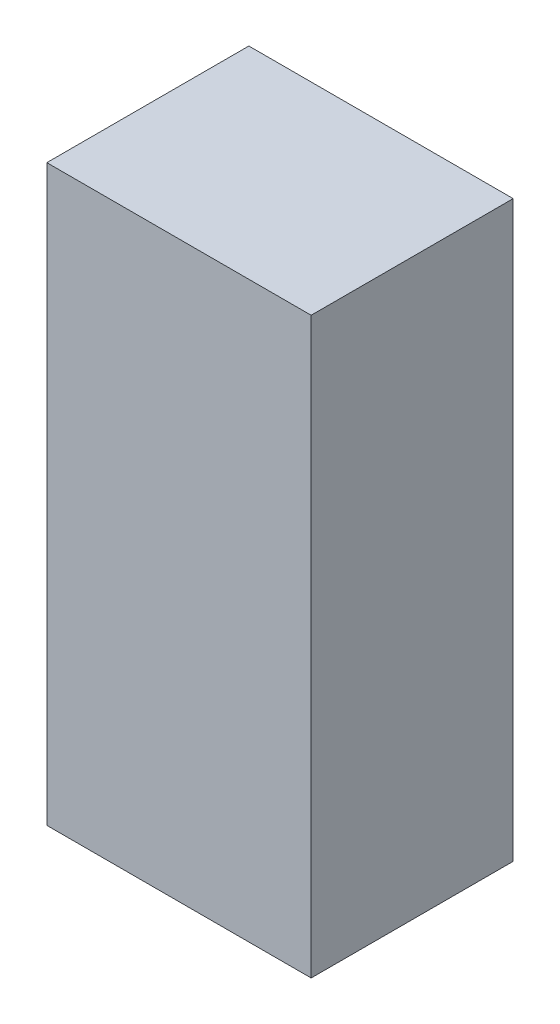
ISO-10303-21;
HEADER;
FILE_DESCRIPTION(('STEP AP214'),'2;1');
FILE_NAME('part.step','',(''),(''),'','','');
FILE_SCHEMA(('AUTOMOTIVE_DESIGN { 1 0 10303 214 1 1 1 1 }'));
ENDSEC;
DATA;
#1=APPLICATION_CONTEXT('core data for automotive mechanical design processes');
#2=APPLICATION_PROTOCOL_DEFINITION('international standard','automotive_design',2000,#1);
#3=PRODUCT_CONTEXT('',#1,'mechanical');
#4=PRODUCT('Part','Part','',(#3));
#5=PRODUCT_RELATED_PRODUCT_CATEGORY('part','',(#4));
#6=PRODUCT_DEFINITION_FORMATION('','',#4);
#7=PRODUCT_DEFINITION_CONTEXT('part definition',#1,'design');
#8=PRODUCT_DEFINITION('design','',#6,#7);
#9=PRODUCT_DEFINITION_SHAPE('','',#8);
#10=(LENGTH_UNIT() NAMED_UNIT(*) SI_UNIT(.MILLI.,.METRE.));
#11=(NAMED_UNIT(*) PLANE_ANGLE_UNIT() SI_UNIT($,.RADIAN.));
#12=(NAMED_UNIT(*) SI_UNIT($,.STERADIAN.) SOLID_ANGLE_UNIT());
#13=UNCERTAINTY_MEASURE_WITH_UNIT(LENGTH_MEASURE(1.E-05),#10,'distance_accuracy_value','');
#14=(GEOMETRIC_REPRESENTATION_CONTEXT(3) GLOBAL_UNCERTAINTY_ASSIGNED_CONTEXT((#13)) GLOBAL_UNIT_ASSIGNED_CONTEXT((#10,
#11,#12)) REPRESENTATION_CONTEXT('',''));
#15=CARTESIAN_POINT('',(0.,0.,0.));
#16=DIRECTION('',(0.,0.,1.));
#17=DIRECTION('',(1.,0.,0.));
#18=AXIS2_PLACEMENT_3D('',#15,#16,#17);
#19=CARTESIAN_POINT('',(0.70000114,-1.5199995,1.0700004));
#20=DIRECTION('',(0.,0.,-1.));
#21=DIRECTION('',(-1.,0.,0.));
#22=AXIS2_PLACEMENT_3D('',#19,#20,#21);
#23=PLANE('',#22);
#24=DIRECTION('',(1.,0.,0.));
#25=VECTOR('',#24,1.);
#26=CARTESIAN_POINT('',(0.70000114,1.5199995,1.0700004));
#27=LINE('',#26,#25);
#28=CARTESIAN_POINT('',(0.70000114,1.5199995,1.0700004));
#29=VERTEX_POINT('',#28);
#30=CARTESIAN_POINT('',(-0.6999986,1.5199995,1.0700004));
#31=VERTEX_POINT('',#30);
#32=EDGE_CURVE('E55',#29,#31,#27,.F.);
#33=ORIENTED_EDGE('',*,*,#32,.T.);
#34=DIRECTION('',(0.,1.,0.));
#35=VECTOR('',#34,1.);
#36=CARTESIAN_POINT('',(-0.6999986,1.5199995,1.0700004));
#37=LINE('',#36,#35);
#38=CARTESIAN_POINT('',(-0.6999986,-1.5199995,1.0700004));
#39=VERTEX_POINT('',#38);
#40=EDGE_CURVE('E57',#31,#39,#37,.F.);
#41=ORIENTED_EDGE('',*,*,#40,.T.);
#42=DIRECTION('',(1.,0.,0.));
#43=VECTOR('',#42,1.);
#44=CARTESIAN_POINT('',(-0.6999986,-1.5199995,1.0700004));
#45=LINE('',#44,#43);
#46=CARTESIAN_POINT('',(0.70000114,-1.5199995,1.0700004));
#47=VERTEX_POINT('',#46);
#48=EDGE_CURVE('E20',#39,#47,#45,.T.);
#49=ORIENTED_EDGE('',*,*,#48,.T.);
#50=DIRECTION('',(0.,1.,0.));
#51=VECTOR('',#50,1.);
#52=CARTESIAN_POINT('',(0.70000114,-1.5199995,1.0700004));
#53=LINE('',#52,#51);
#54=EDGE_CURVE('E80',#47,#29,#53,.T.);
#55=ORIENTED_EDGE('',*,*,#54,.T.);
#56=EDGE_LOOP('',(#33,#41,#49,#55));
#57=FACE_BOUND('',#56,.T.);
#58=ADVANCED_FACE('F17',(#57),#23,.F.);
#59=CARTESIAN_POINT('',(-0.6999986,-1.5199995,0.));
#60=DIRECTION('',(0.,1.,0.));
#61=DIRECTION('',(0.,0.,1.));
#62=AXIS2_PLACEMENT_3D('',#59,#60,#61);
#63=PLANE('',#62);
#64=DIRECTION('',(0.,0.,1.));
#65=VECTOR('',#64,1.);
#66=CARTESIAN_POINT('',(0.70000114,-1.5199995,0.));
#67=LINE('',#66,#65);
#68=CARTESIAN_POINT('',(0.70000114,-1.5199995,0.));
#69=VERTEX_POINT('',#68);
#70=EDGE_CURVE('E68',#69,#47,#67,.T.);
#71=ORIENTED_EDGE('',*,*,#70,.T.);
#72=ORIENTED_EDGE('',*,*,#48,.F.);
#73=DIRECTION('',(0.,0.,-1.));
#74=VECTOR('',#73,1.);
#75=CARTESIAN_POINT('',(-0.6999986,-1.5199995,0.));
#76=LINE('',#75,#74);
#77=CARTESIAN_POINT('',(-0.6999986,-1.5199995,0.));
#78=VERTEX_POINT('',#77);
#79=EDGE_CURVE('E63',#39,#78,#76,.T.);
#80=ORIENTED_EDGE('',*,*,#79,.T.);
#81=DIRECTION('',(-1.,0.,0.));
#82=VECTOR('',#81,1.);
#83=CARTESIAN_POINT('',(0.70000114,-1.5199995,0.));
#84=LINE('',#83,#82);
#85=EDGE_CURVE('E83',#69,#78,#84,.T.);
#86=ORIENTED_EDGE('',*,*,#85,.F.);
#87=EDGE_LOOP('',(#71,#72,#80,#86));
#88=FACE_BOUND('',#87,.T.);
#89=ADVANCED_FACE('F65',(#88),#63,.F.);
#90=CARTESIAN_POINT('',(-0.6999986,1.5199995,0.));
#91=DIRECTION('',(1.,0.,0.));
#92=DIRECTION('',(0.,0.,-1.));
#93=AXIS2_PLACEMENT_3D('',#90,#91,#92);
#94=PLANE('',#93);
#95=ORIENTED_EDGE('',*,*,#79,.F.);
#96=ORIENTED_EDGE('',*,*,#40,.F.);
#97=DIRECTION('',(0.,0.,-1.));
#98=VECTOR('',#97,1.);
#99=CARTESIAN_POINT('',(-0.6999986,1.5199995,0.));
#100=LINE('',#99,#98);
#101=CARTESIAN_POINT('',(-0.6999986,1.5199995,0.));
#102=VERTEX_POINT('',#101);
#103=EDGE_CURVE('E75',#31,#102,#100,.T.);
#104=ORIENTED_EDGE('',*,*,#103,.T.);
#105=DIRECTION('',(0.,1.,0.));
#106=VECTOR('',#105,1.);
#107=CARTESIAN_POINT('',(-0.6999986,-1.5199995,0.));
#108=LINE('',#107,#106);
#109=EDGE_CURVE('E72',#78,#102,#108,.T.);
#110=ORIENTED_EDGE('',*,*,#109,.F.);
#111=EDGE_LOOP('',(#95,#96,#104,#110));
#112=FACE_BOUND('',#111,.T.);
#113=ADVANCED_FACE('F70',(#112),#94,.F.);
#114=CARTESIAN_POINT('',(0.70000114,1.5199995,0.));
#115=DIRECTION('',(0.,-1.,0.));
#116=DIRECTION('',(0.,0.,-1.));
#117=AXIS2_PLACEMENT_3D('',#114,#115,#116);
#118=PLANE('',#117);
#119=ORIENTED_EDGE('',*,*,#103,.F.);
#120=ORIENTED_EDGE('',*,*,#32,.F.);
#121=DIRECTION('',(0.,0.,1.));
#122=VECTOR('',#121,1.);
#123=CARTESIAN_POINT('',(0.70000114,1.5199995,0.));
#124=LINE('',#123,#122);
#125=CARTESIAN_POINT('',(0.70000114,1.5199995,0.));
#126=VERTEX_POINT('',#125);
#127=EDGE_CURVE('E35',#29,#126,#124,.F.);
#128=ORIENTED_EDGE('',*,*,#127,.T.);
#129=DIRECTION('',(-1.,0.,0.));
#130=VECTOR('',#129,1.);
#131=CARTESIAN_POINT('',(0.70000114,1.5199995,0.));
#132=LINE('',#131,#130);
#133=EDGE_CURVE('E26',#102,#126,#132,.F.);
#134=ORIENTED_EDGE('',*,*,#133,.F.);
#135=EDGE_LOOP('',(#119,#120,#128,#134));
#136=FACE_BOUND('',#135,.T.);
#137=ADVANCED_FACE('F89',(#136),#118,.F.);
#138=CARTESIAN_POINT('',(0.70000114,-1.5199995,0.));
#139=DIRECTION('',(-1.,0.,0.));
#140=DIRECTION('',(0.,0.,1.));
#141=AXIS2_PLACEMENT_3D('',#138,#139,#140);
#142=PLANE('',#141);
#143=ORIENTED_EDGE('',*,*,#127,.F.);
#144=ORIENTED_EDGE('',*,*,#54,.F.);
#145=ORIENTED_EDGE('',*,*,#70,.F.);
#146=DIRECTION('',(0.,1.,0.));
#147=VECTOR('',#146,1.);
#148=CARTESIAN_POINT('',(0.70000114,-1.5199995,0.));
#149=LINE('',#148,#147);
#150=EDGE_CURVE('E11',#126,#69,#149,.F.);
#151=ORIENTED_EDGE('',*,*,#150,.F.);
#152=EDGE_LOOP('',(#143,#144,#145,#151));
#153=FACE_BOUND('',#152,.T.);
#154=ADVANCED_FACE('F91',(#153),#142,.F.);
#155=CARTESIAN_POINT('',(0.70000114,-1.5199995,0.));
#156=DIRECTION('',(0.,0.,-1.));
#157=DIRECTION('',(-1.,0.,0.));
#158=AXIS2_PLACEMENT_3D('',#155,#156,#157);
#159=PLANE('',#158);
#160=ORIENTED_EDGE('',*,*,#133,.T.);
#161=ORIENTED_EDGE('',*,*,#150,.T.);
#162=ORIENTED_EDGE('',*,*,#85,.T.);
#163=ORIENTED_EDGE('',*,*,#109,.T.);
#164=EDGE_LOOP('',(#160,#161,#162,#163));
#165=FACE_BOUND('',#164,.T.);
#166=ADVANCED_FACE('F88',(#165),#159,.T.);
#167=CLOSED_SHELL('',(#58,#89,#113,#137,#154,#166));
#168=MANIFOLD_SOLID_BREP('B1',#167);
#169=ADVANCED_BREP_SHAPE_REPRESENTATION('',(#18,#168),#14);
#170=SHAPE_DEFINITION_REPRESENTATION(#9,#169);
ENDSEC;
END-ISO-10303-21;
